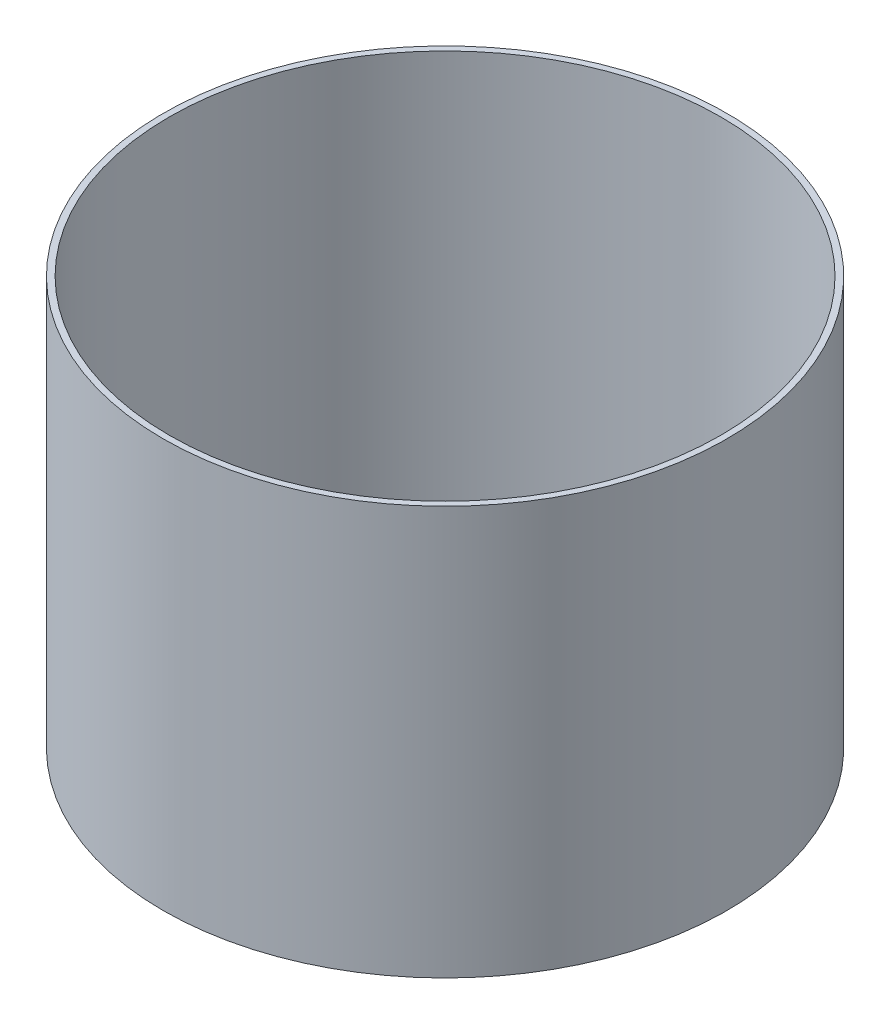
ISO-10303-21;
HEADER;
FILE_DESCRIPTION(('STEP AP214'),'2;1');
FILE_NAME('part.step','',(''),(''),'','','');
FILE_SCHEMA(('AUTOMOTIVE_DESIGN { 1 0 10303 214 1 1 1 1 }'));
ENDSEC;
DATA;
#1=APPLICATION_CONTEXT('core data for automotive mechanical design processes');
#2=APPLICATION_PROTOCOL_DEFINITION('international standard','automotive_design',2000,#1);
#3=PRODUCT_CONTEXT('',#1,'mechanical');
#4=PRODUCT('Part','Part','',(#3));
#5=PRODUCT_RELATED_PRODUCT_CATEGORY('part','',(#4));
#6=PRODUCT_DEFINITION_FORMATION('','',#4);
#7=PRODUCT_DEFINITION_CONTEXT('part definition',#1,'design');
#8=PRODUCT_DEFINITION('design','',#6,#7);
#9=PRODUCT_DEFINITION_SHAPE('','',#8);
#10=(LENGTH_UNIT() NAMED_UNIT(*) SI_UNIT(.MILLI.,.METRE.));
#11=(NAMED_UNIT(*) PLANE_ANGLE_UNIT() SI_UNIT($,.RADIAN.));
#12=(NAMED_UNIT(*) SI_UNIT($,.STERADIAN.) SOLID_ANGLE_UNIT());
#13=UNCERTAINTY_MEASURE_WITH_UNIT(LENGTH_MEASURE(1.E-05),#10,'distance_accuracy_value','');
#14=(GEOMETRIC_REPRESENTATION_CONTEXT(3) GLOBAL_UNCERTAINTY_ASSIGNED_CONTEXT((#13)) GLOBAL_UNIT_ASSIGNED_CONTEXT((#10,
#11,#12)) REPRESENTATION_CONTEXT('',''));
#15=CARTESIAN_POINT('',(0.,0.,0.));
#16=DIRECTION('',(0.,0.,1.));
#17=DIRECTION('',(1.,0.,0.));
#18=AXIS2_PLACEMENT_3D('',#15,#16,#17);
#19=CARTESIAN_POINT('',(0.,1000.,0.));
#20=DIRECTION('',(0.,1.,0.));
#21=DIRECTION('',(0.,0.,1.));
#22=AXIS2_PLACEMENT_3D('',#19,#20,#21);
#23=PLANE('',#22);
#24=CARTESIAN_POINT('',(0.,1000.,0.));
#25=DIRECTION('',(0.,1.,0.));
#26=DIRECTION('',(0.,0.,1.));
#27=AXIS2_PLACEMENT_3D('',#24,#25,#26);
#28=CIRCLE('',#27,690.);
#29=CARTESIAN_POINT('',(0.,1000.,690.));
#30=VERTEX_POINT('',#29);
#31=EDGE_CURVE('E10',#30,#30,#28,.T.);
#32=ORIENTED_EDGE('',*,*,#31,.T.);
#33=EDGE_LOOP('',(#32));
#34=FACE_BOUND('',#33,.T.);
#35=CARTESIAN_POINT('',(0.,1000.,0.));
#36=DIRECTION('',(0.,1.,0.));
#37=DIRECTION('',(0.,0.,1.));
#38=AXIS2_PLACEMENT_3D('',#35,#36,#37);
#39=CIRCLE('',#38,675.);
#40=CARTESIAN_POINT('',(0.,1000.,675.));
#41=VERTEX_POINT('',#40);
#42=EDGE_CURVE('E46',#41,#41,#39,.T.);
#43=ORIENTED_EDGE('',*,*,#42,.F.);
#44=EDGE_LOOP('',(#43));
#45=FACE_BOUND('',#44,.T.);
#46=ADVANCED_FACE('F35',(#34,#45),#23,.T.);
#47=CARTESIAN_POINT('',(0.,0.,0.));
#48=DIRECTION('',(0.,1.,0.));
#49=DIRECTION('',(0.,0.,1.));
#50=AXIS2_PLACEMENT_3D('',#47,#48,#49);
#51=PLANE('',#50);
#52=CARTESIAN_POINT('',(0.,0.,0.));
#53=DIRECTION('',(0.,1.,0.));
#54=DIRECTION('',(0.,0.,1.));
#55=AXIS2_PLACEMENT_3D('',#52,#53,#54);
#56=CIRCLE('',#55,690.);
#57=CARTESIAN_POINT('',(0.,0.,690.));
#58=VERTEX_POINT('',#57);
#59=EDGE_CURVE('E39',#58,#58,#56,.T.);
#60=ORIENTED_EDGE('',*,*,#59,.F.);
#61=EDGE_LOOP('',(#60));
#62=FACE_BOUND('',#61,.T.);
#63=CARTESIAN_POINT('',(0.,0.,0.));
#64=DIRECTION('',(0.,1.,0.));
#65=DIRECTION('',(0.,0.,1.));
#66=AXIS2_PLACEMENT_3D('',#63,#64,#65);
#67=CIRCLE('',#66,675.);
#68=CARTESIAN_POINT('',(0.,0.,675.));
#69=VERTEX_POINT('',#68);
#70=EDGE_CURVE('E48',#69,#69,#67,.T.);
#71=ORIENTED_EDGE('',*,*,#70,.T.);
#72=EDGE_LOOP('',(#71));
#73=FACE_BOUND('',#72,.T.);
#74=ADVANCED_FACE('F58',(#62,#73),#51,.F.);
#75=CARTESIAN_POINT('',(0.,1000.,0.));
#76=DIRECTION('',(0.,-1.,0.));
#77=DIRECTION('',(0.,0.,-1.));
#78=AXIS2_PLACEMENT_3D('',#75,#76,#77);
#79=CYLINDRICAL_SURFACE('',#78,690.);
#80=ORIENTED_EDGE('',*,*,#31,.F.);
#81=EDGE_LOOP('',(#80));
#82=FACE_BOUND('',#81,.T.);
#83=ORIENTED_EDGE('',*,*,#59,.T.);
#84=EDGE_LOOP('',(#83));
#85=FACE_BOUND('',#84,.T.);
#86=ADVANCED_FACE('F37',(#82,#85),#79,.T.);
#87=CARTESIAN_POINT('',(0.,1000.,0.));
#88=DIRECTION('',(0.,-1.,0.));
#89=DIRECTION('',(0.,0.,-1.));
#90=AXIS2_PLACEMENT_3D('',#87,#88,#89);
#91=CYLINDRICAL_SURFACE('',#90,675.);
#92=ORIENTED_EDGE('',*,*,#42,.T.);
#93=EDGE_LOOP('',(#92));
#94=FACE_BOUND('',#93,.T.);
#95=ORIENTED_EDGE('',*,*,#70,.F.);
#96=EDGE_LOOP('',(#95));
#97=FACE_BOUND('',#96,.T.);
#98=ADVANCED_FACE('F54',(#94,#97),#91,.F.);
#99=CLOSED_SHELL('',(#46,#74,#86,#98));
#100=MANIFOLD_SOLID_BREP('B2',#99);
#101=ADVANCED_BREP_SHAPE_REPRESENTATION('',(#18,#100),#14);
#102=SHAPE_DEFINITION_REPRESENTATION(#9,#101);
ENDSEC;
END-ISO-10303-21;
